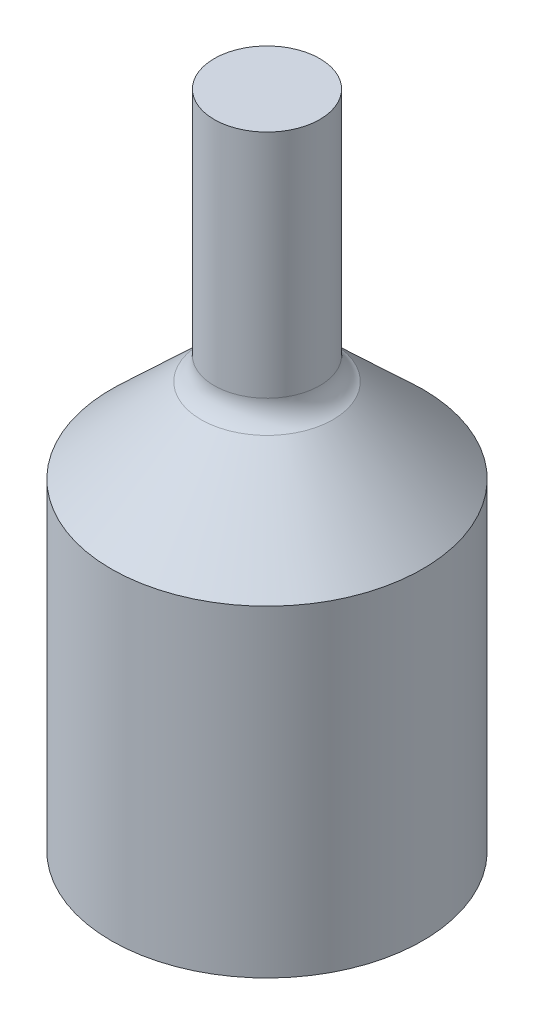
ISO-10303-21;
HEADER;
FILE_DESCRIPTION(('STEP AP214'),'2;1');
FILE_NAME('part.step','',(''),(''),'','','');
FILE_SCHEMA(('AUTOMOTIVE_DESIGN { 1 0 10303 214 1 1 1 1 }'));
ENDSEC;
DATA;
#1=APPLICATION_CONTEXT('core data for automotive mechanical design processes');
#2=APPLICATION_PROTOCOL_DEFINITION('international standard','automotive_design',2000,#1);
#3=PRODUCT_CONTEXT('',#1,'mechanical');
#4=PRODUCT('Part','Part','',(#3));
#5=PRODUCT_RELATED_PRODUCT_CATEGORY('part','',(#4));
#6=PRODUCT_DEFINITION_FORMATION('','',#4);
#7=PRODUCT_DEFINITION_CONTEXT('part definition',#1,'design');
#8=PRODUCT_DEFINITION('design','',#6,#7);
#9=PRODUCT_DEFINITION_SHAPE('','',#8);
#10=(LENGTH_UNIT() NAMED_UNIT(*) SI_UNIT(.MILLI.,.METRE.));
#11=(NAMED_UNIT(*) PLANE_ANGLE_UNIT() SI_UNIT($,.RADIAN.));
#12=(NAMED_UNIT(*) SI_UNIT($,.STERADIAN.) SOLID_ANGLE_UNIT());
#13=UNCERTAINTY_MEASURE_WITH_UNIT(LENGTH_MEASURE(1.E-05),#10,'distance_accuracy_value','');
#14=(GEOMETRIC_REPRESENTATION_CONTEXT(3) GLOBAL_UNCERTAINTY_ASSIGNED_CONTEXT((#13)) GLOBAL_UNIT_ASSIGNED_CONTEXT((#10,
#11,#12)) REPRESENTATION_CONTEXT('',''));
#15=CARTESIAN_POINT('',(0.,0.,0.));
#16=DIRECTION('',(0.,0.,1.));
#17=DIRECTION('',(1.,0.,0.));
#18=AXIS2_PLACEMENT_3D('',#15,#16,#17);
#19=CARTESIAN_POINT('',(0.,7.7,0.));
#20=DIRECTION('',(0.,-1.,0.));
#21=DIRECTION('',(0.,0.,-1.));
#22=AXIS2_PLACEMENT_3D('',#19,#20,#21);
#23=CYLINDRICAL_SURFACE('',#22,2.95);
#24=CARTESIAN_POINT('',(0.,6.1,0.));
#25=DIRECTION('',(0.,1.,0.));
#26=DIRECTION('',(0.,0.,1.));
#27=AXIS2_PLACEMENT_3D('',#24,#25,#26);
#28=CIRCLE('',#27,2.95);
#29=CARTESIAN_POINT('',(0.,6.1,-2.95));
#30=VERTEX_POINT('',#29);
#31=EDGE_CURVE('E46',#30,#30,#28,.T.);
#32=CARTESIAN_POINT('',(0.,0.,0.));
#33=DIRECTION('',(0.,1.,0.));
#34=DIRECTION('',(0.,0.,1.));
#35=AXIS2_PLACEMENT_3D('',#32,#33,#34);
#36=CIRCLE('',#35,2.95);
#37=CARTESIAN_POINT('',(0.,0.,-2.95));
#38=VERTEX_POINT('',#37);
#39=EDGE_CURVE('E38',#38,#38,#36,.T.);
#40=CARTESIAN_POINT('',(0.,6.1,-2.95));
#41=CARTESIAN_POINT('',(0.,6.03645833333333,-2.95));
#42=CARTESIAN_POINT('',(0.,5.97291666666667,-2.95));
#43=CARTESIAN_POINT('',(0.,5.84583333333333,-2.95));
#44=CARTESIAN_POINT('',(0.,5.78229166666667,-2.95));
#45=CARTESIAN_POINT('',(0.,5.65520833333333,-2.95));
#46=CARTESIAN_POINT('',(0.,5.59166666666667,-2.95));
#47=CARTESIAN_POINT('',(0.,5.46458333333333,-2.95));
#48=CARTESIAN_POINT('',(0.,5.40104166666667,-2.95));
#49=CARTESIAN_POINT('',(0.,5.27395833333333,-2.95));
#50=CARTESIAN_POINT('',(0.,5.21041666666667,-2.95));
#51=CARTESIAN_POINT('',(0.,5.08333333333333,-2.95));
#52=CARTESIAN_POINT('',(0.,5.01979166666667,-2.95));
#53=CARTESIAN_POINT('',(0.,4.89270833333333,-2.95));
#54=CARTESIAN_POINT('',(0.,4.82916666666667,-2.95));
#55=CARTESIAN_POINT('',(0.,4.70208333333333,-2.95));
#56=CARTESIAN_POINT('',(0.,4.63854166666667,-2.95));
#57=CARTESIAN_POINT('',(0.,4.51145833333333,-2.95));
#58=CARTESIAN_POINT('',(0.,4.44791666666667,-2.95));
#59=CARTESIAN_POINT('',(0.,4.32083333333333,-2.95));
#60=CARTESIAN_POINT('',(0.,4.25729166666667,-2.95));
#61=CARTESIAN_POINT('',(0.,4.13020833333333,-2.95));
#62=CARTESIAN_POINT('',(0.,4.06666666666667,-2.95));
#63=CARTESIAN_POINT('',(0.,3.93958333333333,-2.95));
#64=CARTESIAN_POINT('',(0.,3.87604166666667,-2.95));
#65=CARTESIAN_POINT('',(0.,3.74895833333333,-2.95));
#66=CARTESIAN_POINT('',(0.,3.68541666666667,-2.95));
#67=CARTESIAN_POINT('',(0.,3.55833333333333,-2.95));
#68=CARTESIAN_POINT('',(0.,3.49479166666667,-2.95));
#69=CARTESIAN_POINT('',(0.,3.36770833333333,-2.95));
#70=CARTESIAN_POINT('',(0.,3.30416666666667,-2.95));
#71=CARTESIAN_POINT('',(0.,3.17708333333333,-2.95));
#72=CARTESIAN_POINT('',(0.,3.11354166666667,-2.95));
#73=CARTESIAN_POINT('',(0.,2.98645833333333,-2.95));
#74=CARTESIAN_POINT('',(0.,2.92291666666667,-2.95));
#75=CARTESIAN_POINT('',(0.,2.79583333333333,-2.95));
#76=CARTESIAN_POINT('',(0.,2.73229166666667,-2.95));
#77=CARTESIAN_POINT('',(0.,2.60520833333333,-2.95));
#78=CARTESIAN_POINT('',(0.,2.54166666666667,-2.95));
#79=CARTESIAN_POINT('',(0.,2.41458333333333,-2.95));
#80=CARTESIAN_POINT('',(0.,2.35104166666667,-2.95));
#81=CARTESIAN_POINT('',(0.,2.22395833333333,-2.95));
#82=CARTESIAN_POINT('',(0.,2.16041666666667,-2.95));
#83=CARTESIAN_POINT('',(0.,2.03333333333333,-2.95));
#84=CARTESIAN_POINT('',(0.,1.96979166666667,-2.95));
#85=CARTESIAN_POINT('',(0.,1.84270833333333,-2.95));
#86=CARTESIAN_POINT('',(0.,1.77916666666667,-2.95));
#87=CARTESIAN_POINT('',(0.,1.65208333333333,-2.95));
#88=CARTESIAN_POINT('',(0.,1.58854166666667,-2.95));
#89=CARTESIAN_POINT('',(0.,1.46145833333333,-2.95));
#90=CARTESIAN_POINT('',(0.,1.39791666666667,-2.95));
#91=CARTESIAN_POINT('',(0.,1.27083333333333,-2.95));
#92=CARTESIAN_POINT('',(0.,1.20729166666667,-2.95));
#93=CARTESIAN_POINT('',(0.,1.08020833333333,-2.95));
#94=CARTESIAN_POINT('',(0.,1.01666666666667,-2.95));
#95=CARTESIAN_POINT('',(0.,0.889583333333333,-2.95));
#96=CARTESIAN_POINT('',(0.,0.826041666666666,-2.95));
#97=CARTESIAN_POINT('',(0.,0.698958333333333,-2.95));
#98=CARTESIAN_POINT('',(0.,0.635416666666666,-2.95));
#99=CARTESIAN_POINT('',(0.,0.508333333333333,-2.95));
#100=CARTESIAN_POINT('',(0.,0.444791666666666,-2.95));
#101=CARTESIAN_POINT('',(0.,0.317708333333332,-2.95));
#102=CARTESIAN_POINT('',(0.,0.254166666666666,-2.95));
#103=CARTESIAN_POINT('',(0.,0.127083333333332,-2.95));
#104=CARTESIAN_POINT('',(0.,0.0635416666666657,-2.95));
#105=CARTESIAN_POINT('',(0.,0.,-2.95));
#106=B_SPLINE_CURVE_WITH_KNOTS('',3,(#40,#41,#42,#43,#44,#45,#46,#47,#48,#49,#50,#51,#52,#53,
#54,#55,#56,#57,#58,#59,#60,#61,#62,#63,#64,#65,#66,#67,#68,#69,#70,#71,#72,#73,#74,#75,#76,#77,
#78,#79,#80,#81,#82,#83,#84,#85,#86,#87,#88,#89,#90,#91,#92,#93,#94,#95,#96,#97,#98,#99,#100,
#101,#102,#103,#104,#105),.UNSPECIFIED.,.F.,.F.,(4,2,2,2,2,2,2,2,2,2,2,2,2,2,2,2,2,2,2,2,2,2,2,
2,2,2,2,2,2,2,2,2,4),(0.,0.190625,0.38125,0.571874999999999,0.7625,0.953125,1.14375,1.334375,
1.525,1.715625,1.90625,2.096875,2.2875,2.478125,2.66875,2.859375,3.05,3.240625,3.43125,3.621875,
3.8125,4.003125,4.19375,4.384375,4.575,4.765625,4.95625,5.146875,5.3375,5.528125,5.71875,
5.909375,6.1),.UNSPECIFIED.);
#107=EDGE_CURVE('BSEAM31',#30,#38,#106,.T.);
#108=ORIENTED_EDGE('',*,*,#31,.F.);
#109=ORIENTED_EDGE('',*,*,#39,.T.);
#110=ORIENTED_EDGE('',*,*,#107,.T.);
#111=ORIENTED_EDGE('',*,*,#107,.F.);
#112=EDGE_LOOP('',(#108,#110,#109,#111));
#113=FACE_BOUND('',#112,.T.);
#114=ADVANCED_FACE('F31',(#113),#23,.T.);
#115=CARTESIAN_POINT('',(0.,0.,0.));
#116=DIRECTION('',(0.,1.,0.));
#117=DIRECTION('',(0.,0.,1.));
#118=AXIS2_PLACEMENT_3D('',#115,#116,#117);
#119=PLANE('',#118);
#120=ORIENTED_EDGE('',*,*,#39,.F.);
#121=EDGE_LOOP('',(#120));
#122=FACE_BOUND('',#121,.T.);
#123=ADVANCED_FACE('F66',(#122),#119,.F.);
#124=CARTESIAN_POINT('',(0.,6.1,0.));
#125=DIRECTION('',(0.,-1.,0.));
#126=DIRECTION('',(0.,0.,-1.));
#127=AXIS2_PLACEMENT_3D('',#124,#125,#126);
#128=CONICAL_SURFACE('',#127,2.95,0.815691923316223);
#129=CARTESIAN_POINT('',(0.,7.7,0.));
#130=DIRECTION('',(0.,1.,0.));
#131=DIRECTION('',(0.,0.,1.));
#132=AXIS2_PLACEMENT_3D('',#129,#130,#131);
#133=CIRCLE('',#132,1.25);
#134=CARTESIAN_POINT('',(0.,7.7,1.25));
#135=VERTEX_POINT('',#134);
#136=EDGE_CURVE('E42',#135,#135,#133,.T.);
#137=ORIENTED_EDGE('',*,*,#136,.F.);
#138=EDGE_LOOP('',(#137));
#139=FACE_BOUND('',#138,.T.);
#140=ORIENTED_EDGE('',*,*,#31,.T.);
#141=EDGE_LOOP('',(#140));
#142=FACE_BOUND('',#141,.T.);
#143=ADVANCED_FACE('F59',(#139,#142),#128,.T.);
#144=CARTESIAN_POINT('',(0.,12.5,0.));
#145=DIRECTION('',(0.,-1.,0.));
#146=DIRECTION('',(0.,0.,-1.));
#147=AXIS2_PLACEMENT_3D('',#144,#145,#146);
#148=CYLINDRICAL_SURFACE('',#147,1.);
#149=CARTESIAN_POINT('',(0.,8.13301270189222,0.));
#150=DIRECTION('',(0.,-1.,0.));
#151=DIRECTION('',(0.,0.,-1.));
#152=AXIS2_PLACEMENT_3D('',#149,#150,#151);
#153=CIRCLE('',#152,1.);
#154=CARTESIAN_POINT('',(0.,8.13301270189222,-1.));
#155=VERTEX_POINT('',#154);
#156=EDGE_CURVE('E10',#155,#155,#153,.F.);
#157=ORIENTED_EDGE('',*,*,#156,.T.);
#158=EDGE_LOOP('',(#157));
#159=FACE_BOUND('',#158,.T.);
#160=CARTESIAN_POINT('',(0.,12.5,0.));
#161=DIRECTION('',(0.,1.,0.));
#162=DIRECTION('',(0.,0.,1.));
#163=AXIS2_PLACEMENT_3D('',#160,#161,#162);
#164=CIRCLE('',#163,1.);
#165=CARTESIAN_POINT('',(0.,12.5,1.));
#166=VERTEX_POINT('',#165);
#167=EDGE_CURVE('E51',#166,#166,#164,.T.);
#168=ORIENTED_EDGE('',*,*,#167,.F.);
#169=EDGE_LOOP('',(#168));
#170=FACE_BOUND('',#169,.T.);
#171=ADVANCED_FACE('F57',(#159,#170),#148,.T.);
#172=CARTESIAN_POINT('',(0.,12.5,0.));
#173=DIRECTION('',(0.,1.,0.));
#174=DIRECTION('',(0.,0.,1.));
#175=AXIS2_PLACEMENT_3D('',#172,#173,#174);
#176=PLANE('',#175);
#177=ORIENTED_EDGE('',*,*,#167,.T.);
#178=EDGE_LOOP('',(#177));
#179=FACE_BOUND('',#178,.T.);
#180=ADVANCED_FACE('F55',(#179),#176,.T.);
#181=CARTESIAN_POINT('',(0.,8.13301270189222,0.));
#182=DIRECTION('',(0.,-1.,0.));
#183=DIRECTION('',(0.,0.,-1.));
#184=AXIS2_PLACEMENT_3D('',#181,#182,#183);
#185=TOROIDAL_SURFACE('',#184,1.5,0.5);
#186=ORIENTED_EDGE('',*,*,#136,.T.);
#187=EDGE_LOOP('',(#186));
#188=FACE_BOUND('',#187,.T.);
#189=ORIENTED_EDGE('',*,*,#156,.F.);
#190=EDGE_LOOP('',(#189));
#191=FACE_BOUND('',#190,.T.);
#192=ADVANCED_FACE('F33',(#188,#191),#185,.F.);
#193=CLOSED_SHELL('',(#114,#123,#143,#171,#180,#192));
#194=MANIFOLD_SOLID_BREP('B2',#193);
#195=ADVANCED_BREP_SHAPE_REPRESENTATION('',(#18,#194),#14);
#196=SHAPE_DEFINITION_REPRESENTATION(#9,#195);
ENDSEC;
END-ISO-10303-21;
